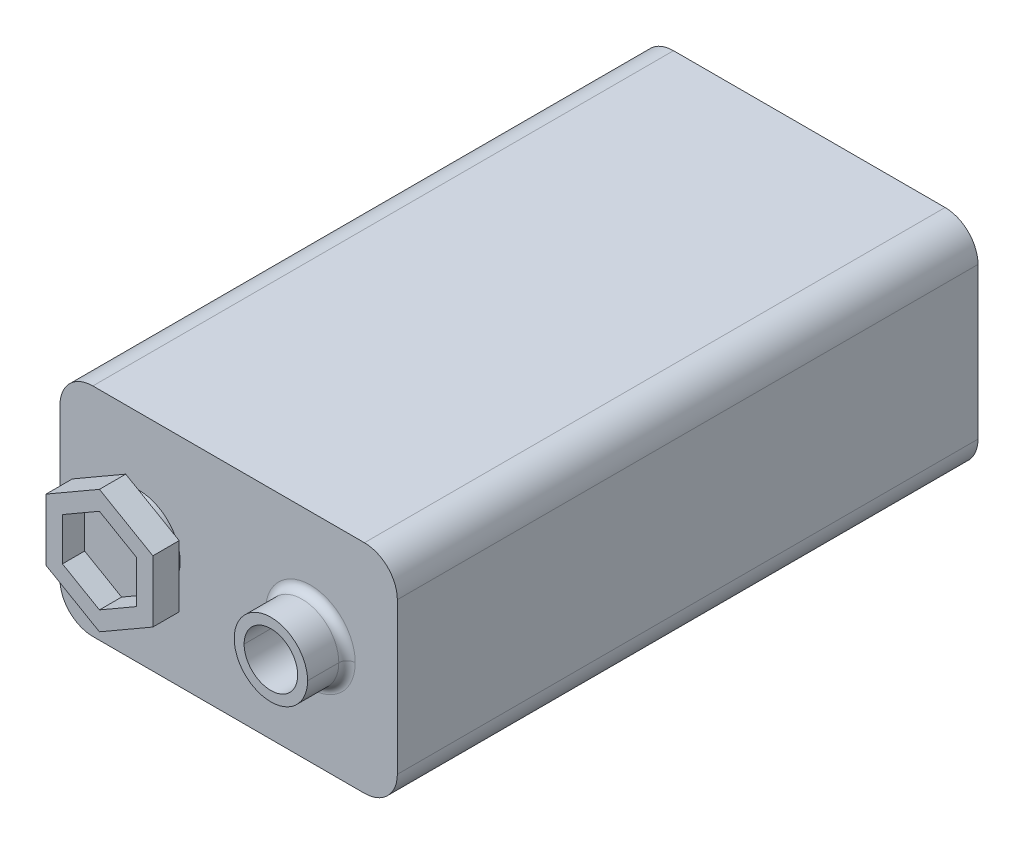
ISO-10303-21;
HEADER;
FILE_DESCRIPTION(('STEP AP214'),'2;1');
FILE_NAME('part.step','',(''),(''),'','','');
FILE_SCHEMA(('AUTOMOTIVE_DESIGN { 1 0 10303 214 1 1 1 1 }'));
ENDSEC;
DATA;
#1=APPLICATION_CONTEXT('core data for automotive mechanical design processes');
#2=APPLICATION_PROTOCOL_DEFINITION('international standard','automotive_design',2000,#1);
#3=PRODUCT_CONTEXT('',#1,'mechanical');
#4=PRODUCT('Part','Part','',(#3));
#5=PRODUCT_RELATED_PRODUCT_CATEGORY('part','',(#4));
#6=PRODUCT_DEFINITION_FORMATION('','',#4);
#7=PRODUCT_DEFINITION_CONTEXT('part definition',#1,'design');
#8=PRODUCT_DEFINITION('design','',#6,#7);
#9=PRODUCT_DEFINITION_SHAPE('','',#8);
#10=(LENGTH_UNIT() NAMED_UNIT(*) SI_UNIT(.MILLI.,.METRE.));
#11=(NAMED_UNIT(*) PLANE_ANGLE_UNIT() SI_UNIT($,.RADIAN.));
#12=(NAMED_UNIT(*) SI_UNIT($,.STERADIAN.) SOLID_ANGLE_UNIT());
#13=UNCERTAINTY_MEASURE_WITH_UNIT(LENGTH_MEASURE(1.E-05),#10,'distance_accuracy_value','');
#14=(GEOMETRIC_REPRESENTATION_CONTEXT(3) GLOBAL_UNCERTAINTY_ASSIGNED_CONTEXT((#13)) GLOBAL_UNIT_ASSIGNED_CONTEXT((#10,
#11,#12)) REPRESENTATION_CONTEXT('',''));
#15=CARTESIAN_POINT('',(0.,0.,0.));
#16=DIRECTION('',(0.,0.,1.));
#17=DIRECTION('',(1.,0.,0.));
#18=AXIS2_PLACEMENT_3D('',#15,#16,#17);
#19=CARTESIAN_POINT('',(6.3119,0.,25.654));
#20=DIRECTION('',(0.,0.,-1.));
#21=DIRECTION('',(-1.,0.,0.));
#22=AXIS2_PLACEMENT_3D('',#19,#20,#21);
#23=CYLINDRICAL_SURFACE('',#22,2.0701);
#24=DIRECTION('',(0.,0.,-1.));
#25=VECTOR('',#24,1.);
#26=CARTESIAN_POINT('',(8.382,0.,25.654));
#27=LINE('',#26,#25);
#28=CARTESIAN_POINT('',(8.382,0.,25.4762));
#29=VERTEX_POINT('',#28);
#30=CARTESIAN_POINT('',(8.382,0.,22.4282));
#31=VERTEX_POINT('',#30);
#32=EDGE_CURVE('E442',#29,#31,#27,.T.);
#33=ORIENTED_EDGE('',*,*,#32,.F.);
#34=CARTESIAN_POINT('',(6.3119,0.,25.4762));
#35=DIRECTION('',(0.,0.,1.));
#36=DIRECTION('',(1.,0.,0.));
#37=AXIS2_PLACEMENT_3D('',#34,#35,#36);
#38=CIRCLE('',#37,2.0701);
#39=CARTESIAN_POINT('',(4.2418,0.,25.4762));
#40=VERTEX_POINT('',#39);
#41=EDGE_CURVE('E381',#29,#40,#38,.T.);
#42=ORIENTED_EDGE('',*,*,#41,.T.);
#43=DIRECTION('',(0.,0.,-1.));
#44=VECTOR('',#43,1.);
#45=CARTESIAN_POINT('',(4.2418,0.,25.654));
#46=LINE('',#45,#44);
#47=CARTESIAN_POINT('',(4.2418,0.,22.4282));
#48=VERTEX_POINT('',#47);
#49=EDGE_CURVE('E458',#40,#48,#46,.T.);
#50=ORIENTED_EDGE('',*,*,#49,.T.);
#51=CARTESIAN_POINT('',(6.3119,0.,22.4282));
#52=DIRECTION('',(0.,0.,1.));
#53=DIRECTION('',(1.,0.,0.));
#54=AXIS2_PLACEMENT_3D('',#51,#52,#53);
#55=CIRCLE('',#54,2.0701);
#56=EDGE_CURVE('E11',#31,#48,#55,.T.);
#57=ORIENTED_EDGE('',*,*,#56,.F.);
#58=EDGE_LOOP('',(#33,#42,#50,#57));
#59=FACE_BOUND('',#58,.T.);
#60=ADVANCED_FACE('F16',(#59),#23,.F.);
#61=CARTESIAN_POINT('',(-13.0302,8.382,22.4282));
#62=DIRECTION('',(0.,0.,-1.));
#63=DIRECTION('',(0.,-1.,0.));
#64=AXIS2_PLACEMENT_3D('',#61,#62,#63);
#65=PLANE('',#64);
#66=CARTESIAN_POINT('',(6.3119,0.,22.4282));
#67=DIRECTION('',(0.,0.,1.));
#68=DIRECTION('',(1.,0.,0.));
#69=AXIS2_PLACEMENT_3D('',#66,#67,#68);
#70=CIRCLE('',#69,2.0701);
#71=EDGE_CURVE('E463',#48,#31,#70,.T.);
#72=ORIENTED_EDGE('',*,*,#71,.T.);
#73=ORIENTED_EDGE('',*,*,#56,.T.);
#74=EDGE_LOOP('',(#72,#73));
#75=FACE_BOUND('',#74,.T.);
#76=ADVANCED_FACE('F500',(#75),#65,.F.);
#77=CARTESIAN_POINT('',(-6.9342,3.29955678841871,42.2007207872868));
#78=DIRECTION('',(0.5,-0.866025403784439,0.));
#79=DIRECTION('',(0.,0.,-1.));
#80=AXIS2_PLACEMENT_3D('',#77,#78,#79);
#81=PLANE('',#80);
#82=DIRECTION('',(0.,0.,-1.));
#83=VECTOR('',#82,1.);
#84=CARTESIAN_POINT('',(-6.9342,3.29955678841871,42.2007207872868));
#85=LINE('',#84,#83);
#86=CARTESIAN_POINT('',(-6.9342,3.29955678841871,25.4762));
#87=VERTEX_POINT('',#86);
#88=CARTESIAN_POINT('',(-6.9342,3.29955678841871,23.7617));
#89=VERTEX_POINT('',#88);
#90=EDGE_CURVE('E341',#87,#89,#85,.T.);
#91=ORIENTED_EDGE('',*,*,#90,.F.);
#92=DIRECTION('',(-0.866025403784439,-0.5,0.));
#93=VECTOR('',#92,1.);
#94=CARTESIAN_POINT('',(-6.9342,3.29955678841871,25.4762));
#95=LINE('',#94,#93);
#96=CARTESIAN_POINT('',(-9.7917,1.64977839420935,25.4762));
#97=VERTEX_POINT('',#96);
#98=EDGE_CURVE('E378',#87,#97,#95,.T.);
#99=ORIENTED_EDGE('',*,*,#98,.T.);
#100=DIRECTION('',(0.,0.,-1.));
#101=VECTOR('',#100,1.);
#102=CARTESIAN_POINT('',(-9.7917,1.64977839420935,42.2007207872868));
#103=LINE('',#102,#101);
#104=CARTESIAN_POINT('',(-9.7917,1.64977839420935,23.7617));
#105=VERTEX_POINT('',#104);
#106=EDGE_CURVE('E27',#97,#105,#103,.T.);
#107=ORIENTED_EDGE('',*,*,#106,.T.);
#108=DIRECTION('',(-0.866025403784439,-0.5,0.));
#109=VECTOR('',#108,1.);
#110=CARTESIAN_POINT('',(-9.7917,1.64977839420935,23.7617));
#111=LINE('',#110,#109);
#112=EDGE_CURVE('E303',#89,#105,#111,.T.);
#113=ORIENTED_EDGE('',*,*,#112,.F.);
#114=EDGE_LOOP('',(#91,#99,#107,#113));
#115=FACE_BOUND('',#114,.T.);
#116=ADVANCED_FACE('F480',(#115),#81,.T.);
#117=CARTESIAN_POINT('',(-9.7917,1.64977839420935,42.2007207872868));
#118=DIRECTION('',(1.,0.,0.));
#119=DIRECTION('',(0.,1.,0.));
#120=AXIS2_PLACEMENT_3D('',#117,#118,#119);
#121=PLANE('',#120);
#122=ORIENTED_EDGE('',*,*,#106,.F.);
#123=DIRECTION('',(0.,-1.,0.));
#124=VECTOR('',#123,1.);
#125=CARTESIAN_POINT('',(-9.7917,1.64977839420935,25.4762));
#126=LINE('',#125,#124);
#127=CARTESIAN_POINT('',(-9.7917,-1.64977839420935,25.4762));
#128=VERTEX_POINT('',#127);
#129=EDGE_CURVE('E377',#97,#128,#126,.T.);
#130=ORIENTED_EDGE('',*,*,#129,.T.);
#131=DIRECTION('',(0.,0.,-1.));
#132=VECTOR('',#131,1.);
#133=CARTESIAN_POINT('',(-9.7917,-1.64977839420935,42.2007207872868));
#134=LINE('',#133,#132);
#135=CARTESIAN_POINT('',(-9.7917,-1.64977839420935,23.7617));
#136=VERTEX_POINT('',#135);
#137=EDGE_CURVE('E219',#128,#136,#134,.T.);
#138=ORIENTED_EDGE('',*,*,#137,.T.);
#139=DIRECTION('',(0.,-1.,0.));
#140=VECTOR('',#139,1.);
#141=CARTESIAN_POINT('',(-9.7917,-1.64977839420935,23.7617));
#142=LINE('',#141,#140);
#143=EDGE_CURVE('E387',#105,#136,#142,.T.);
#144=ORIENTED_EDGE('',*,*,#143,.F.);
#145=EDGE_LOOP('',(#122,#130,#138,#144));
#146=FACE_BOUND('',#145,.T.);
#147=ADVANCED_FACE('F488',(#146),#121,.T.);
#148=CARTESIAN_POINT('',(-9.7917,-1.64977839420935,42.2007207872868));
#149=DIRECTION('',(0.5,0.866025403784439,0.));
#150=DIRECTION('',(0.,0.,-1.));
#151=AXIS2_PLACEMENT_3D('',#148,#149,#150);
#152=PLANE('',#151);
#153=ORIENTED_EDGE('',*,*,#137,.F.);
#154=DIRECTION('',(0.866025403784439,-0.5,0.));
#155=VECTOR('',#154,1.);
#156=CARTESIAN_POINT('',(-9.7917,-1.64977839420935,25.4762));
#157=LINE('',#156,#155);
#158=CARTESIAN_POINT('',(-6.9342,-3.29955678841871,25.4762));
#159=VERTEX_POINT('',#158);
#160=EDGE_CURVE('E379',#128,#159,#157,.T.);
#161=ORIENTED_EDGE('',*,*,#160,.T.);
#162=DIRECTION('',(0.,0.,-1.));
#163=VECTOR('',#162,1.);
#164=CARTESIAN_POINT('',(-6.9342,-3.29955678841871,42.2007207872868));
#165=LINE('',#164,#163);
#166=CARTESIAN_POINT('',(-6.9342,-3.29955678841871,23.7617));
#167=VERTEX_POINT('',#166);
#168=EDGE_CURVE('E310',#159,#167,#165,.T.);
#169=ORIENTED_EDGE('',*,*,#168,.T.);
#170=DIRECTION('',(0.866025403784439,-0.5,0.));
#171=VECTOR('',#170,1.);
#172=CARTESIAN_POINT('',(-6.9342,-3.29955678841871,23.7617));
#173=LINE('',#172,#171);
#174=EDGE_CURVE('E332',#136,#167,#173,.T.);
#175=ORIENTED_EDGE('',*,*,#174,.F.);
#176=EDGE_LOOP('',(#153,#161,#169,#175));
#177=FACE_BOUND('',#176,.T.);
#178=ADVANCED_FACE('F490',(#177),#152,.T.);
#179=CARTESIAN_POINT('',(-6.9342,-3.29955678841871,42.2007207872868));
#180=DIRECTION('',(-0.5,0.866025403784439,0.));
#181=DIRECTION('',(0.,0.,1.));
#182=AXIS2_PLACEMENT_3D('',#179,#180,#181);
#183=PLANE('',#182);
#184=ORIENTED_EDGE('',*,*,#168,.F.);
#185=DIRECTION('',(0.866025403784439,0.5,0.));
#186=VECTOR('',#185,1.);
#187=CARTESIAN_POINT('',(-6.9342,-3.29955678841871,25.4762));
#188=LINE('',#187,#186);
#189=CARTESIAN_POINT('',(-4.0767,-1.64977839420935,25.4762));
#190=VERTEX_POINT('',#189);
#191=EDGE_CURVE('E427',#159,#190,#188,.T.);
#192=ORIENTED_EDGE('',*,*,#191,.T.);
#193=DIRECTION('',(0.,0.,-1.));
#194=VECTOR('',#193,1.);
#195=CARTESIAN_POINT('',(-4.0767,-1.64977839420935,42.2007207872868));
#196=LINE('',#195,#194);
#197=CARTESIAN_POINT('',(-4.0767,-1.64977839420935,23.7617));
#198=VERTEX_POINT('',#197);
#199=EDGE_CURVE('E313',#190,#198,#196,.T.);
#200=ORIENTED_EDGE('',*,*,#199,.T.);
#201=DIRECTION('',(0.866025403784439,0.5,0.));
#202=VECTOR('',#201,1.);
#203=CARTESIAN_POINT('',(-4.0767,-1.64977839420935,23.7617));
#204=LINE('',#203,#202);
#205=EDGE_CURVE('E329',#167,#198,#204,.T.);
#206=ORIENTED_EDGE('',*,*,#205,.F.);
#207=EDGE_LOOP('',(#184,#192,#200,#206));
#208=FACE_BOUND('',#207,.T.);
#209=ADVANCED_FACE('F497',(#208),#183,.T.);
#210=CARTESIAN_POINT('',(-4.0767,-1.64977839420935,42.2007207872868));
#211=DIRECTION('',(-1.,0.,0.));
#212=DIRECTION('',(0.,0.,1.));
#213=AXIS2_PLACEMENT_3D('',#210,#211,#212);
#214=PLANE('',#213);
#215=ORIENTED_EDGE('',*,*,#199,.F.);
#216=DIRECTION('',(0.,1.,0.));
#217=VECTOR('',#216,1.);
#218=CARTESIAN_POINT('',(-4.0767,-1.64977839420935,25.4762));
#219=LINE('',#218,#217);
#220=CARTESIAN_POINT('',(-4.0767,1.64977839420935,25.4762));
#221=VERTEX_POINT('',#220);
#222=EDGE_CURVE('E605',#190,#221,#219,.T.);
#223=ORIENTED_EDGE('',*,*,#222,.T.);
#224=DIRECTION('',(0.,0.,-1.));
#225=VECTOR('',#224,1.);
#226=CARTESIAN_POINT('',(-4.0767,1.64977839420935,42.2007207872868));
#227=LINE('',#226,#225);
#228=CARTESIAN_POINT('',(-4.0767,1.64977839420935,23.7617));
#229=VERTEX_POINT('',#228);
#230=EDGE_CURVE('E298',#221,#229,#227,.T.);
#231=ORIENTED_EDGE('',*,*,#230,.T.);
#232=DIRECTION('',(0.,1.,0.));
#233=VECTOR('',#232,1.);
#234=CARTESIAN_POINT('',(-4.0767,1.64977839420935,23.7617));
#235=LINE('',#234,#233);
#236=EDGE_CURVE('E20',#198,#229,#235,.T.);
#237=ORIENTED_EDGE('',*,*,#236,.F.);
#238=EDGE_LOOP('',(#215,#223,#231,#237));
#239=FACE_BOUND('',#238,.T.);
#240=ADVANCED_FACE('F514',(#239),#214,.T.);
#241=CARTESIAN_POINT('',(-4.0767,1.64977839420935,42.2007207872868));
#242=DIRECTION('',(-0.5,-0.866025403784439,0.));
#243=DIRECTION('',(-0.866025403784439,0.5,0.));
#244=AXIS2_PLACEMENT_3D('',#241,#242,#243);
#245=PLANE('',#244);
#246=ORIENTED_EDGE('',*,*,#230,.F.);
#247=DIRECTION('',(-0.866025403784439,0.5,0.));
#248=VECTOR('',#247,1.);
#249=CARTESIAN_POINT('',(-4.0767,1.64977839420935,25.4762));
#250=LINE('',#249,#248);
#251=EDGE_CURVE('E602',#221,#87,#250,.T.);
#252=ORIENTED_EDGE('',*,*,#251,.T.);
#253=ORIENTED_EDGE('',*,*,#90,.T.);
#254=DIRECTION('',(-0.866025403784439,0.5,0.));
#255=VECTOR('',#254,1.);
#256=CARTESIAN_POINT('',(-6.9342,3.29955678841871,23.7617));
#257=LINE('',#256,#255);
#258=EDGE_CURVE('E300',#229,#89,#257,.T.);
#259=ORIENTED_EDGE('',*,*,#258,.F.);
#260=EDGE_LOOP('',(#246,#252,#253,#259));
#261=FACE_BOUND('',#260,.T.);
#262=ADVANCED_FACE('F18',(#261),#245,.T.);
#263=CARTESIAN_POINT('',(0.,0.,23.7617));
#264=DIRECTION('',(0.,0.,-1.));
#265=DIRECTION('',(0.,-1.,0.));
#266=AXIS2_PLACEMENT_3D('',#263,#264,#265);
#267=PLANE('',#266);
#268=ORIENTED_EDGE('',*,*,#174,.T.);
#269=ORIENTED_EDGE('',*,*,#205,.T.);
#270=ORIENTED_EDGE('',*,*,#236,.T.);
#271=ORIENTED_EDGE('',*,*,#258,.T.);
#272=ORIENTED_EDGE('',*,*,#112,.T.);
#273=ORIENTED_EDGE('',*,*,#143,.T.);
#274=EDGE_LOOP('',(#268,#269,#270,#271,#272,#273));
#275=FACE_BOUND('',#274,.T.);
#276=ADVANCED_FACE('F1143',(#275),#267,.F.);
#277=CARTESIAN_POINT('',(-13.0302,8.382,25.4762));
#278=DIRECTION('',(0.,0.,1.));
#279=DIRECTION('',(1.,0.,0.));
#280=AXIS2_PLACEMENT_3D('',#277,#278,#279);
#281=PLANE('',#280);
#282=CARTESIAN_POINT('',(6.3119,0.,25.4762));
#283=DIRECTION('',(0.,0.,1.));
#284=DIRECTION('',(1.,0.,0.));
#285=AXIS2_PLACEMENT_3D('',#282,#283,#284);
#286=CIRCLE('',#285,2.0701);
#287=EDGE_CURVE('E438',#40,#29,#286,.T.);
#288=ORIENTED_EDGE('',*,*,#287,.F.);
#289=ORIENTED_EDGE('',*,*,#41,.F.);
#290=EDGE_LOOP('',(#288,#289));
#291=FACE_BOUND('',#290,.T.);
#292=CARTESIAN_POINT('',(6.3119,0.,25.4762));
#293=DIRECTION('',(0.,0.,1.));
#294=DIRECTION('',(1.,0.,0.));
#295=AXIS2_PLACEMENT_3D('',#292,#293,#294);
#296=CIRCLE('',#295,2.8321);
#297=CARTESIAN_POINT('',(3.4798,0.,25.4762));
#298=VERTEX_POINT('',#297);
#299=CARTESIAN_POINT('',(9.144,0.,25.4762));
#300=VERTEX_POINT('',#299);
#301=EDGE_CURVE('E348',#298,#300,#296,.T.);
#302=ORIENTED_EDGE('',*,*,#301,.T.);
#303=CARTESIAN_POINT('',(6.3119,0.,25.4762));
#304=DIRECTION('',(0.,0.,1.));
#305=DIRECTION('',(1.,0.,0.));
#306=AXIS2_PLACEMENT_3D('',#303,#304,#305);
#307=CIRCLE('',#306,2.8321);
#308=EDGE_CURVE('E372',#300,#298,#307,.T.);
#309=ORIENTED_EDGE('',*,*,#308,.T.);
#310=EDGE_LOOP('',(#302,#309));
#311=FACE_BOUND('',#310,.T.);
#312=ADVANCED_FACE('F672',(#291,#311),#281,.T.);
#313=CARTESIAN_POINT('',(-13.0302,8.382,25.4762));
#314=DIRECTION('',(0.,0.,1.));
#315=DIRECTION('',(1.,0.,0.));
#316=AXIS2_PLACEMENT_3D('',#313,#314,#315);
#317=PLANE('',#316);
#318=ORIENTED_EDGE('',*,*,#251,.F.);
#319=ORIENTED_EDGE('',*,*,#222,.F.);
#320=ORIENTED_EDGE('',*,*,#191,.F.);
#321=ORIENTED_EDGE('',*,*,#160,.F.);
#322=ORIENTED_EDGE('',*,*,#129,.F.);
#323=ORIENTED_EDGE('',*,*,#98,.F.);
#324=EDGE_LOOP('',(#318,#319,#320,#321,#322,#323));
#325=FACE_BOUND('',#324,.T.);
#326=DIRECTION('',(0.,1.,0.));
#327=VECTOR('',#326,1.);
#328=CARTESIAN_POINT('',(-2.8067,-2.38301323608018,25.4762));
#329=LINE('',#328,#327);
#330=CARTESIAN_POINT('',(-2.8067,-2.38301323608018,25.4762));
#331=VERTEX_POINT('',#330);
#332=CARTESIAN_POINT('',(-2.8067,2.38301323608018,25.4762));
#333=VERTEX_POINT('',#332);
#334=EDGE_CURVE('E359',#331,#333,#329,.T.);
#335=ORIENTED_EDGE('',*,*,#334,.T.);
#336=DIRECTION('',(-0.866025403784439,0.5,0.));
#337=VECTOR('',#336,1.);
#338=CARTESIAN_POINT('',(-2.8067,2.38301323608018,25.4762));
#339=LINE('',#338,#337);
#340=CARTESIAN_POINT('',(-6.9342,4.76602647216036,25.4762));
#341=VERTEX_POINT('',#340);
#342=EDGE_CURVE('E324',#333,#341,#339,.T.);
#343=ORIENTED_EDGE('',*,*,#342,.T.);
#344=DIRECTION('',(-0.866025403784439,-0.5,0.));
#345=VECTOR('',#344,1.);
#346=CARTESIAN_POINT('',(-6.9342,4.76602647216036,25.4762));
#347=LINE('',#346,#345);
#348=CARTESIAN_POINT('',(-11.0617,2.38301323608018,25.4762));
#349=VERTEX_POINT('',#348);
#350=EDGE_CURVE('E429',#341,#349,#347,.T.);
#351=ORIENTED_EDGE('',*,*,#350,.T.);
#352=DIRECTION('',(0.,-1.,0.));
#353=VECTOR('',#352,1.);
#354=CARTESIAN_POINT('',(-11.0617,2.38301323608018,25.4762));
#355=LINE('',#354,#353);
#356=CARTESIAN_POINT('',(-11.0617,-2.38301323608018,25.4762));
#357=VERTEX_POINT('',#356);
#358=EDGE_CURVE('E399',#349,#357,#355,.T.);
#359=ORIENTED_EDGE('',*,*,#358,.T.);
#360=DIRECTION('',(0.866025403784439,-0.5,0.));
#361=VECTOR('',#360,1.);
#362=CARTESIAN_POINT('',(-11.0617,-2.38301323608018,25.4762));
#363=LINE('',#362,#361);
#364=CARTESIAN_POINT('',(-6.9342,-4.76602647216036,25.4762));
#365=VERTEX_POINT('',#364);
#366=EDGE_CURVE('E539',#357,#365,#363,.T.);
#367=ORIENTED_EDGE('',*,*,#366,.T.);
#368=DIRECTION('',(0.866025403784439,0.5,0.));
#369=VECTOR('',#368,1.);
#370=CARTESIAN_POINT('',(-6.9342,-4.76602647216036,25.4762));
#371=LINE('',#370,#369);
#372=EDGE_CURVE('E409',#365,#331,#371,.T.);
#373=ORIENTED_EDGE('',*,*,#372,.T.);
#374=EDGE_LOOP('',(#335,#343,#351,#359,#367,#373));
#375=FACE_BOUND('',#374,.T.);
#376=ADVANCED_FACE('F485',(#325,#375),#317,.T.);
#377=CARTESIAN_POINT('',(-6.9342,0.,22.8092));
#378=DIRECTION('',(0.,0.,1.));
#379=DIRECTION('',(1.,0.,0.));
#380=AXIS2_PLACEMENT_3D('',#377,#378,#379);
#381=TOROIDAL_SURFACE('',#380,3.8227,0.635);
#382=CARTESIAN_POINT('',(-10.7569,0.,22.8092));
#383=DIRECTION('',(0.,1.,0.));
#384=DIRECTION('',(-1.,0.,0.));
#385=AXIS2_PLACEMENT_3D('',#382,#383,#384);
#386=CIRCLE('',#385,0.635);
#387=CARTESIAN_POINT('',(-10.7569,0.,23.4442));
#388=VERTEX_POINT('',#387);
#389=CARTESIAN_POINT('',(-10.1219,0.,22.8092));
#390=VERTEX_POINT('',#389);
#391=EDGE_CURVE('E464',#388,#390,#386,.T.);
#392=ORIENTED_EDGE('',*,*,#391,.F.);
#393=CARTESIAN_POINT('',(-6.9342,0.,23.4442));
#394=DIRECTION('',(0.,0.,1.));
#395=DIRECTION('',(1.,0.,0.));
#396=AXIS2_PLACEMENT_3D('',#393,#394,#395);
#397=CIRCLE('',#396,3.8227);
#398=CARTESIAN_POINT('',(-3.1115,0.,23.4442));
#399=VERTEX_POINT('',#398);
#400=EDGE_CURVE('E337',#399,#388,#397,.T.);
#401=ORIENTED_EDGE('',*,*,#400,.F.);
#402=CARTESIAN_POINT('',(-3.1115,0.,22.8092));
#403=DIRECTION('',(0.,-1.,0.));
#404=DIRECTION('',(0.,0.,-1.));
#405=AXIS2_PLACEMENT_3D('',#402,#403,#404);
#406=CIRCLE('',#405,0.635);
#407=CARTESIAN_POINT('',(-3.7465,0.,22.8092));
#408=VERTEX_POINT('',#407);
#409=EDGE_CURVE('E417',#399,#408,#406,.T.);
#410=ORIENTED_EDGE('',*,*,#409,.T.);
#411=CARTESIAN_POINT('',(-6.9342,0.,22.8092));
#412=DIRECTION('',(0.,0.,-1.));
#413=DIRECTION('',(1.,0.,0.));
#414=AXIS2_PLACEMENT_3D('',#411,#412,#413);
#415=CIRCLE('',#414,3.1877);
#416=EDGE_CURVE('E620',#390,#408,#415,.T.);
#417=ORIENTED_EDGE('',*,*,#416,.F.);
#418=EDGE_LOOP('',(#392,#401,#410,#417));
#419=FACE_BOUND('',#418,.T.);
#420=ADVANCED_FACE('F1197',(#419),#381,.F.);
#421=CARTESIAN_POINT('',(6.3119,0.,23.0632));
#422=DIRECTION('',(0.,0.,-1.));
#423=DIRECTION('',(-1.,0.,0.));
#424=AXIS2_PLACEMENT_3D('',#421,#422,#423);
#425=TOROIDAL_SURFACE('',#424,3.4671,0.635);
#426=CARTESIAN_POINT('',(9.779,0.,23.0632));
#427=DIRECTION('',(0.,1.,0.));
#428=DIRECTION('',(-1.,0.,0.));
#429=AXIS2_PLACEMENT_3D('',#426,#427,#428);
#430=CIRCLE('',#429,0.635);
#431=CARTESIAN_POINT('',(9.779,0.,22.4282));
#432=VERTEX_POINT('',#431);
#433=CARTESIAN_POINT('',(9.144,0.,23.0632));
#434=VERTEX_POINT('',#433);
#435=EDGE_CURVE('E468',#432,#434,#430,.T.);
#436=ORIENTED_EDGE('',*,*,#435,.F.);
#437=CARTESIAN_POINT('',(6.3119,0.,22.4282));
#438=DIRECTION('',(0.,0.,-1.));
#439=DIRECTION('',(-1.,0.,0.));
#440=AXIS2_PLACEMENT_3D('',#437,#438,#439);
#441=CIRCLE('',#440,3.4671);
#442=CARTESIAN_POINT('',(2.8448,0.,22.4282));
#443=VERTEX_POINT('',#442);
#444=EDGE_CURVE('E474',#443,#432,#441,.T.);
#445=ORIENTED_EDGE('',*,*,#444,.F.);
#446=CARTESIAN_POINT('',(2.8448,0.,23.0632));
#447=DIRECTION('',(0.,-1.,0.));
#448=DIRECTION('',(0.,0.,-1.));
#449=AXIS2_PLACEMENT_3D('',#446,#447,#448);
#450=CIRCLE('',#449,0.635);
#451=CARTESIAN_POINT('',(3.4798,0.,23.0632));
#452=VERTEX_POINT('',#451);
#453=EDGE_CURVE('E624',#443,#452,#450,.T.);
#454=ORIENTED_EDGE('',*,*,#453,.T.);
#455=CARTESIAN_POINT('',(6.3119,0.,23.0632));
#456=DIRECTION('',(0.,0.,1.));
#457=DIRECTION('',(-1.,0.,0.));
#458=AXIS2_PLACEMENT_3D('',#455,#456,#457);
#459=CIRCLE('',#458,2.8321);
#460=EDGE_CURVE('E349',#434,#452,#459,.T.);
#461=ORIENTED_EDGE('',*,*,#460,.F.);
#462=EDGE_LOOP('',(#436,#445,#454,#461));
#463=FACE_BOUND('',#462,.T.);
#464=ADVANCED_FACE('F663',(#463),#425,.F.);
#465=CARTESIAN_POINT('',(-10.4902,5.842,0.));
#466=DIRECTION('',(0.,0.,1.));
#467=DIRECTION('',(1.,0.,0.));
#468=AXIS2_PLACEMENT_3D('',#465,#466,#467);
#469=CYLINDRICAL_SURFACE('',#468,2.54);
#470=CARTESIAN_POINT('',(-10.4902,5.842,-22.4282));
#471=DIRECTION('',(0.,0.,-1.));
#472=DIRECTION('',(1.,0.,0.));
#473=AXIS2_PLACEMENT_3D('',#470,#471,#472);
#474=CIRCLE('',#473,2.54);
#475=CARTESIAN_POINT('',(-13.0302,5.842,-22.4282));
#476=VERTEX_POINT('',#475);
#477=CARTESIAN_POINT('',(-10.4902,8.382,-22.4282));
#478=VERTEX_POINT('',#477);
#479=EDGE_CURVE('E452',#476,#478,#474,.T.);
#480=ORIENTED_EDGE('',*,*,#479,.F.);
#481=DIRECTION('',(0.,0.,-1.));
#482=VECTOR('',#481,1.);
#483=CARTESIAN_POINT('',(-13.0302,5.842,22.4282));
#484=LINE('',#483,#482);
#485=CARTESIAN_POINT('',(-13.0302,5.842,22.4282));
#486=VERTEX_POINT('',#485);
#487=EDGE_CURVE('E287',#486,#476,#484,.T.);
#488=ORIENTED_EDGE('',*,*,#487,.F.);
#489=CARTESIAN_POINT('',(-10.4902,5.842,22.4282));
#490=DIRECTION('',(0.,0.,1.));
#491=DIRECTION('',(-1.,0.,0.));
#492=AXIS2_PLACEMENT_3D('',#489,#490,#491);
#493=CIRCLE('',#492,2.54);
#494=CARTESIAN_POINT('',(-10.4902,8.382,22.4282));
#495=VERTEX_POINT('',#494);
#496=EDGE_CURVE('E280',#495,#486,#493,.T.);
#497=ORIENTED_EDGE('',*,*,#496,.F.);
#498=DIRECTION('',(0.,0.,1.));
#499=VECTOR('',#498,1.);
#500=CARTESIAN_POINT('',(-10.4902,8.382,0.));
#501=LINE('',#500,#499);
#502=EDGE_CURVE('E270',#478,#495,#501,.T.);
#503=ORIENTED_EDGE('',*,*,#502,.F.);
#504=EDGE_LOOP('',(#480,#488,#497,#503));
#505=FACE_BOUND('',#504,.T.);
#506=ADVANCED_FACE('F525',(#505),#469,.T.);
#507=CARTESIAN_POINT('',(-10.4902,-5.842,22.4282));
#508=DIRECTION('',(0.,0.,-1.));
#509=DIRECTION('',(-1.,0.,0.));
#510=AXIS2_PLACEMENT_3D('',#507,#508,#509);
#511=CYLINDRICAL_SURFACE('',#510,2.54);
#512=CARTESIAN_POINT('',(-10.4902,-5.842,-22.4282));
#513=DIRECTION('',(0.,0.,-1.));
#514=DIRECTION('',(1.,0.,0.));
#515=AXIS2_PLACEMENT_3D('',#512,#513,#514);
#516=CIRCLE('',#515,2.54);
#517=CARTESIAN_POINT('',(-10.4902,-8.382,-22.4282));
#518=VERTEX_POINT('',#517);
#519=CARTESIAN_POINT('',(-13.0302,-5.842,-22.4282));
#520=VERTEX_POINT('',#519);
#521=EDGE_CURVE('E415',#518,#520,#516,.T.);
#522=ORIENTED_EDGE('',*,*,#521,.F.);
#523=DIRECTION('',(0.,0.,-1.));
#524=VECTOR('',#523,1.);
#525=CARTESIAN_POINT('',(-10.4902,-8.382,-22.4282));
#526=LINE('',#525,#524);
#527=CARTESIAN_POINT('',(-10.4902,-8.382,22.4282));
#528=VERTEX_POINT('',#527);
#529=EDGE_CURVE('E334',#528,#518,#526,.T.);
#530=ORIENTED_EDGE('',*,*,#529,.F.);
#531=CARTESIAN_POINT('',(-10.4902,-5.842,22.4282));
#532=DIRECTION('',(0.,0.,1.));
#533=DIRECTION('',(-1.,0.,0.));
#534=AXIS2_PLACEMENT_3D('',#531,#532,#533);
#535=CIRCLE('',#534,2.54);
#536=CARTESIAN_POINT('',(-13.0302,-5.842,22.4282));
#537=VERTEX_POINT('',#536);
#538=EDGE_CURVE('E395',#537,#528,#535,.T.);
#539=ORIENTED_EDGE('',*,*,#538,.F.);
#540=DIRECTION('',(0.,0.,1.));
#541=VECTOR('',#540,1.);
#542=CARTESIAN_POINT('',(-13.0302,-5.842,22.4282));
#543=LINE('',#542,#541);
#544=EDGE_CURVE('E448',#520,#537,#543,.T.);
#545=ORIENTED_EDGE('',*,*,#544,.F.);
#546=EDGE_LOOP('',(#522,#530,#539,#545));
#547=FACE_BOUND('',#546,.T.);
#548=ADVANCED_FACE('F522',(#547),#511,.T.);
#549=CARTESIAN_POINT('',(10.4902,-5.842,22.4282));
#550=DIRECTION('',(0.,0.,1.));
#551=DIRECTION('',(1.,0.,0.));
#552=AXIS2_PLACEMENT_3D('',#549,#550,#551);
#553=CYLINDRICAL_SURFACE('',#552,2.54);
#554=CARTESIAN_POINT('',(10.4902,-5.842,22.4282));
#555=DIRECTION('',(0.,0.,1.));
#556=DIRECTION('',(-1.,0.,0.));
#557=AXIS2_PLACEMENT_3D('',#554,#555,#556);
#558=CIRCLE('',#557,2.54);
#559=CARTESIAN_POINT('',(10.4902,-8.382,22.4282));
#560=VERTEX_POINT('',#559);
#561=CARTESIAN_POINT('',(13.0302,-5.842,22.4282));
#562=VERTEX_POINT('',#561);
#563=EDGE_CURVE('E394',#560,#562,#558,.T.);
#564=ORIENTED_EDGE('',*,*,#563,.F.);
#565=DIRECTION('',(0.,0.,1.));
#566=VECTOR('',#565,1.);
#567=CARTESIAN_POINT('',(10.4902,-8.382,22.4282));
#568=LINE('',#567,#566);
#569=CARTESIAN_POINT('',(10.4902,-8.382,-22.4282));
#570=VERTEX_POINT('',#569);
#571=EDGE_CURVE('E338',#570,#560,#568,.T.);
#572=ORIENTED_EDGE('',*,*,#571,.F.);
#573=CARTESIAN_POINT('',(10.4902,-5.842,-22.4282));
#574=DIRECTION('',(0.,0.,-1.));
#575=DIRECTION('',(1.,0.,0.));
#576=AXIS2_PLACEMENT_3D('',#573,#574,#575);
#577=CIRCLE('',#576,2.54);
#578=CARTESIAN_POINT('',(13.0302,-5.842,-22.4282));
#579=VERTEX_POINT('',#578);
#580=EDGE_CURVE('E416',#579,#570,#577,.T.);
#581=ORIENTED_EDGE('',*,*,#580,.F.);
#582=DIRECTION('',(0.,0.,-1.));
#583=VECTOR('',#582,1.);
#584=CARTESIAN_POINT('',(13.0302,-5.842,-22.4282));
#585=LINE('',#584,#583);
#586=EDGE_CURVE('E314',#562,#579,#585,.T.);
#587=ORIENTED_EDGE('',*,*,#586,.F.);
#588=EDGE_LOOP('',(#564,#572,#581,#587));
#589=FACE_BOUND('',#588,.T.);
#590=ADVANCED_FACE('F524',(#589),#553,.T.);
#591=CARTESIAN_POINT('',(10.4902,5.842,0.));
#592=DIRECTION('',(0.,0.,-1.));
#593=DIRECTION('',(-1.,0.,0.));
#594=AXIS2_PLACEMENT_3D('',#591,#592,#593);
#595=CYLINDRICAL_SURFACE('',#594,2.54);
#596=CARTESIAN_POINT('',(10.4902,5.842,22.4282));
#597=DIRECTION('',(0.,0.,1.));
#598=DIRECTION('',(-1.,0.,0.));
#599=AXIS2_PLACEMENT_3D('',#596,#597,#598);
#600=CIRCLE('',#599,2.54);
#601=CARTESIAN_POINT('',(13.0302,5.842,22.4282));
#602=VERTEX_POINT('',#601);
#603=CARTESIAN_POINT('',(10.4902,8.382,22.4282));
#604=VERTEX_POINT('',#603);
#605=EDGE_CURVE('E263',#602,#604,#600,.T.);
#606=ORIENTED_EDGE('',*,*,#605,.F.);
#607=DIRECTION('',(0.,0.,1.));
#608=VECTOR('',#607,1.);
#609=CARTESIAN_POINT('',(13.0302,5.842,22.4282));
#610=LINE('',#609,#608);
#611=CARTESIAN_POINT('',(13.0302,5.842,-22.4282));
#612=VERTEX_POINT('',#611);
#613=EDGE_CURVE('E323',#612,#602,#610,.T.);
#614=ORIENTED_EDGE('',*,*,#613,.F.);
#615=CARTESIAN_POINT('',(10.4902,5.842,-22.4282));
#616=DIRECTION('',(0.,0.,-1.));
#617=DIRECTION('',(1.,0.,0.));
#618=AXIS2_PLACEMENT_3D('',#615,#616,#617);
#619=CIRCLE('',#618,2.54);
#620=CARTESIAN_POINT('',(10.4902,8.382,-22.4282));
#621=VERTEX_POINT('',#620);
#622=EDGE_CURVE('E265',#621,#612,#619,.T.);
#623=ORIENTED_EDGE('',*,*,#622,.F.);
#624=DIRECTION('',(0.,0.,-1.));
#625=VECTOR('',#624,1.);
#626=CARTESIAN_POINT('',(10.4902,8.382,0.));
#627=LINE('',#626,#625);
#628=EDGE_CURVE('E258',#604,#621,#627,.T.);
#629=ORIENTED_EDGE('',*,*,#628,.F.);
#630=EDGE_LOOP('',(#606,#614,#623,#629));
#631=FACE_BOUND('',#630,.T.);
#632=ADVANCED_FACE('F260',(#631),#595,.T.);
#633=CARTESIAN_POINT('',(0.,0.,23.4442));
#634=DIRECTION('',(0.,0.,1.));
#635=DIRECTION('',(1.,0.,0.));
#636=AXIS2_PLACEMENT_3D('',#633,#634,#635);
#637=PLANE('',#636);
#638=ORIENTED_EDGE('',*,*,#400,.T.);
#639=CARTESIAN_POINT('',(-6.9342,0.,23.4442));
#640=DIRECTION('',(0.,0.,1.));
#641=DIRECTION('',(1.,0.,0.));
#642=AXIS2_PLACEMENT_3D('',#639,#640,#641);
#643=CIRCLE('',#642,3.8227);
#644=EDGE_CURVE('E462',#388,#399,#643,.T.);
#645=ORIENTED_EDGE('',*,*,#644,.T.);
#646=EDGE_LOOP('',(#638,#645));
#647=FACE_BOUND('',#646,.T.);
#648=DIRECTION('',(0.,1.,0.));
#649=VECTOR('',#648,1.);
#650=CARTESIAN_POINT('',(-2.8067,-2.38301323608018,23.4442));
#651=LINE('',#650,#649);
#652=CARTESIAN_POINT('',(-2.8067,-2.38301323608018,23.4442));
#653=VERTEX_POINT('',#652);
#654=CARTESIAN_POINT('',(-2.8067,2.38301323608018,23.4442));
#655=VERTEX_POINT('',#654);
#656=EDGE_CURVE('E304',#653,#655,#651,.T.);
#657=ORIENTED_EDGE('',*,*,#656,.F.);
#658=DIRECTION('',(0.866025403784439,0.5,0.));
#659=VECTOR('',#658,1.);
#660=CARTESIAN_POINT('',(-6.9342,-4.76602647216036,23.4442));
#661=LINE('',#660,#659);
#662=CARTESIAN_POINT('',(-6.9342,-4.76602647216036,23.4442));
#663=VERTEX_POINT('',#662);
#664=EDGE_CURVE('E345',#663,#653,#661,.T.);
#665=ORIENTED_EDGE('',*,*,#664,.F.);
#666=DIRECTION('',(0.866025403784439,-0.5,0.));
#667=VECTOR('',#666,1.);
#668=CARTESIAN_POINT('',(-11.0617,-2.38301323608018,23.4442));
#669=LINE('',#668,#667);
#670=CARTESIAN_POINT('',(-11.0617,-2.38301323608018,23.4442));
#671=VERTEX_POINT('',#670);
#672=EDGE_CURVE('E410',#671,#663,#669,.T.);
#673=ORIENTED_EDGE('',*,*,#672,.F.);
#674=DIRECTION('',(0.,-1.,0.));
#675=VECTOR('',#674,1.);
#676=CARTESIAN_POINT('',(-11.0617,2.38301323608018,23.4442));
#677=LINE('',#676,#675);
#678=CARTESIAN_POINT('',(-11.0617,2.38301323608018,23.4442));
#679=VERTEX_POINT('',#678);
#680=EDGE_CURVE('E403',#679,#671,#677,.T.);
#681=ORIENTED_EDGE('',*,*,#680,.F.);
#682=DIRECTION('',(-0.866025403784439,-0.5,0.));
#683=VECTOR('',#682,1.);
#684=CARTESIAN_POINT('',(-6.9342,4.76602647216036,23.4442));
#685=LINE('',#684,#683);
#686=CARTESIAN_POINT('',(-6.9342,4.76602647216036,23.4442));
#687=VERTEX_POINT('',#686);
#688=EDGE_CURVE('E433',#687,#679,#685,.T.);
#689=ORIENTED_EDGE('',*,*,#688,.F.);
#690=DIRECTION('',(-0.866025403784439,0.5,0.));
#691=VECTOR('',#690,1.);
#692=CARTESIAN_POINT('',(-2.8067,2.38301323608018,23.4442));
#693=LINE('',#692,#691);
#694=EDGE_CURVE('E328',#655,#687,#693,.T.);
#695=ORIENTED_EDGE('',*,*,#694,.F.);
#696=EDGE_LOOP('',(#657,#665,#673,#681,#689,#695));
#697=FACE_BOUND('',#696,.T.);
#698=ADVANCED_FACE('F917',(#647,#697),#637,.F.);
#699=CARTESIAN_POINT('',(-6.9342,0.,23.4442));
#700=DIRECTION('',(0.,0.,-1.));
#701=DIRECTION('',(-1.,0.,0.));
#702=AXIS2_PLACEMENT_3D('',#699,#700,#701);
#703=CYLINDRICAL_SURFACE('',#702,3.1877);
#704=DIRECTION('',(0.,0.,-1.));
#705=VECTOR('',#704,1.);
#706=CARTESIAN_POINT('',(-3.7465,0.,23.4442));
#707=LINE('',#706,#705);
#708=CARTESIAN_POINT('',(-3.7465,0.,22.4282));
#709=VERTEX_POINT('',#708);
#710=EDGE_CURVE('E616',#408,#709,#707,.T.);
#711=ORIENTED_EDGE('',*,*,#710,.F.);
#712=CARTESIAN_POINT('',(-6.9342,0.,22.8092));
#713=DIRECTION('',(0.,0.,-1.));
#714=DIRECTION('',(1.,0.,0.));
#715=AXIS2_PLACEMENT_3D('',#712,#713,#714);
#716=CIRCLE('',#715,3.1877);
#717=EDGE_CURVE('E422',#408,#390,#716,.T.);
#718=ORIENTED_EDGE('',*,*,#717,.T.);
#719=DIRECTION('',(0.,0.,-1.));
#720=VECTOR('',#719,1.);
#721=CARTESIAN_POINT('',(-10.1219,0.,23.4442));
#722=LINE('',#721,#720);
#723=CARTESIAN_POINT('',(-10.1219,0.,22.4282));
#724=VERTEX_POINT('',#723);
#725=EDGE_CURVE('E569',#390,#724,#722,.T.);
#726=ORIENTED_EDGE('',*,*,#725,.T.);
#727=CARTESIAN_POINT('',(-6.9342,0.,22.4282));
#728=DIRECTION('',(0.,0.,1.));
#729=DIRECTION('',(-1.,0.,0.));
#730=AXIS2_PLACEMENT_3D('',#727,#728,#729);
#731=CIRCLE('',#730,3.1877);
#732=EDGE_CURVE('E271',#724,#709,#731,.T.);
#733=ORIENTED_EDGE('',*,*,#732,.T.);
#734=EDGE_LOOP('',(#711,#718,#726,#733));
#735=FACE_BOUND('',#734,.T.);
#736=ADVANCED_FACE('F931',(#735),#703,.T.);
#737=CARTESIAN_POINT('',(0.,-8.382,0.));
#738=DIRECTION('',(0.,-1.,0.));
#739=DIRECTION('',(0.,0.,-1.));
#740=AXIS2_PLACEMENT_3D('',#737,#738,#739);
#741=PLANE('',#740);
#742=DIRECTION('',(-1.,0.,0.));
#743=VECTOR('',#742,1.);
#744=CARTESIAN_POINT('',(-13.0302,-8.382,-22.4282));
#745=LINE('',#744,#743);
#746=EDGE_CURVE('E411',#570,#518,#745,.T.);
#747=ORIENTED_EDGE('',*,*,#746,.F.);
#748=ORIENTED_EDGE('',*,*,#571,.T.);
#749=DIRECTION('',(1.,0.,0.));
#750=VECTOR('',#749,1.);
#751=CARTESIAN_POINT('',(-13.0302,-8.382,22.4282));
#752=LINE('',#751,#750);
#753=EDGE_CURVE('E390',#528,#560,#752,.T.);
#754=ORIENTED_EDGE('',*,*,#753,.F.);
#755=ORIENTED_EDGE('',*,*,#529,.T.);
#756=EDGE_LOOP('',(#747,#748,#754,#755));
#757=FACE_BOUND('',#756,.T.);
#758=ADVANCED_FACE('F925',(#757),#741,.T.);
#759=CARTESIAN_POINT('',(0.,8.382,0.));
#760=DIRECTION('',(0.,-1.,0.));
#761=DIRECTION('',(0.,0.,-1.));
#762=AXIS2_PLACEMENT_3D('',#759,#760,#761);
#763=PLANE('',#762);
#764=DIRECTION('',(1.,0.,0.));
#765=VECTOR('',#764,1.);
#766=CARTESIAN_POINT('',(-13.0302,8.382,22.4282));
#767=LINE('',#766,#765);
#768=EDGE_CURVE('E274',#495,#604,#767,.T.);
#769=ORIENTED_EDGE('',*,*,#768,.T.);
#770=ORIENTED_EDGE('',*,*,#628,.T.);
#771=DIRECTION('',(-1.,0.,0.));
#772=VECTOR('',#771,1.);
#773=CARTESIAN_POINT('',(-13.0302,8.382,-22.4282));
#774=LINE('',#773,#772);
#775=EDGE_CURVE('E318',#621,#478,#774,.T.);
#776=ORIENTED_EDGE('',*,*,#775,.T.);
#777=ORIENTED_EDGE('',*,*,#502,.T.);
#778=EDGE_LOOP('',(#769,#770,#776,#777));
#779=FACE_BOUND('',#778,.T.);
#780=ADVANCED_FACE('F275',(#779),#763,.F.);
#781=CARTESIAN_POINT('',(-13.0302,8.382,22.4282));
#782=DIRECTION('',(0.,0.,-1.));
#783=DIRECTION('',(0.,-1.,0.));
#784=AXIS2_PLACEMENT_3D('',#781,#782,#783);
#785=PLANE('',#784);
#786=ORIENTED_EDGE('',*,*,#732,.F.);
#787=CARTESIAN_POINT('',(-6.9342,0.,22.4282));
#788=DIRECTION('',(0.,0.,1.));
#789=DIRECTION('',(-1.,0.,0.));
#790=AXIS2_PLACEMENT_3D('',#787,#788,#789);
#791=CIRCLE('',#790,3.1877);
#792=EDGE_CURVE('E612',#709,#724,#791,.T.);
#793=ORIENTED_EDGE('',*,*,#792,.F.);
#794=EDGE_LOOP('',(#786,#793));
#795=FACE_BOUND('',#794,.T.);
#796=ORIENTED_EDGE('',*,*,#444,.T.);
#797=CARTESIAN_POINT('',(6.3119,0.,22.4282));
#798=DIRECTION('',(0.,0.,-1.));
#799=DIRECTION('',(-1.,0.,0.));
#800=AXIS2_PLACEMENT_3D('',#797,#798,#799);
#801=CIRCLE('',#800,3.4671);
#802=EDGE_CURVE('E421',#432,#443,#801,.T.);
#803=ORIENTED_EDGE('',*,*,#802,.T.);
#804=EDGE_LOOP('',(#796,#803));
#805=FACE_BOUND('',#804,.T.);
#806=DIRECTION('',(0.,-1.,0.));
#807=VECTOR('',#806,1.);
#808=CARTESIAN_POINT('',(13.0302,8.382,22.4282));
#809=LINE('',#808,#807);
#810=EDGE_CURVE('E284',#602,#562,#809,.T.);
#811=ORIENTED_EDGE('',*,*,#810,.F.);
#812=ORIENTED_EDGE('',*,*,#605,.T.);
#813=ORIENTED_EDGE('',*,*,#768,.F.);
#814=ORIENTED_EDGE('',*,*,#496,.T.);
#815=DIRECTION('',(0.,-1.,0.));
#816=VECTOR('',#815,1.);
#817=CARTESIAN_POINT('',(-13.0302,8.382,22.4282));
#818=LINE('',#817,#816);
#819=EDGE_CURVE('E294',#486,#537,#818,.T.);
#820=ORIENTED_EDGE('',*,*,#819,.T.);
#821=ORIENTED_EDGE('',*,*,#538,.T.);
#822=ORIENTED_EDGE('',*,*,#753,.T.);
#823=ORIENTED_EDGE('',*,*,#563,.T.);
#824=EDGE_LOOP('',(#811,#812,#813,#814,#820,#821,#822,#823));
#825=FACE_BOUND('',#824,.T.);
#826=ADVANCED_FACE('F282',(#795,#805,#825),#785,.F.);
#827=CARTESIAN_POINT('',(-13.0302,8.382,22.4282));
#828=DIRECTION('',(1.,0.,0.));
#829=DIRECTION('',(0.,1.,0.));
#830=AXIS2_PLACEMENT_3D('',#827,#828,#829);
#831=PLANE('',#830);
#832=DIRECTION('',(0.,-1.,0.));
#833=VECTOR('',#832,1.);
#834=CARTESIAN_POINT('',(-13.0302,8.382,-22.4282));
#835=LINE('',#834,#833);
#836=EDGE_CURVE('E574',#476,#520,#835,.T.);
#837=ORIENTED_EDGE('',*,*,#836,.T.);
#838=ORIENTED_EDGE('',*,*,#544,.T.);
#839=ORIENTED_EDGE('',*,*,#819,.F.);
#840=ORIENTED_EDGE('',*,*,#487,.T.);
#841=EDGE_LOOP('',(#837,#838,#839,#840));
#842=FACE_BOUND('',#841,.T.);
#843=ADVANCED_FACE('F955',(#842),#831,.F.);
#844=CARTESIAN_POINT('',(-13.0302,8.382,-22.4282));
#845=DIRECTION('',(0.,0.,1.));
#846=DIRECTION('',(1.,0.,0.));
#847=AXIS2_PLACEMENT_3D('',#844,#845,#846);
#848=PLANE('',#847);
#849=ORIENTED_EDGE('',*,*,#775,.F.);
#850=ORIENTED_EDGE('',*,*,#622,.T.);
#851=DIRECTION('',(0.,-1.,0.));
#852=VECTOR('',#851,1.);
#853=CARTESIAN_POINT('',(13.0302,8.382,-22.4282));
#854=LINE('',#853,#852);
#855=EDGE_CURVE('E342',#612,#579,#854,.T.);
#856=ORIENTED_EDGE('',*,*,#855,.T.);
#857=ORIENTED_EDGE('',*,*,#580,.T.);
#858=ORIENTED_EDGE('',*,*,#746,.T.);
#859=ORIENTED_EDGE('',*,*,#521,.T.);
#860=ORIENTED_EDGE('',*,*,#836,.F.);
#861=ORIENTED_EDGE('',*,*,#479,.T.);
#862=EDGE_LOOP('',(#849,#850,#856,#857,#858,#859,#860,#861));
#863=FACE_BOUND('',#862,.T.);
#864=ADVANCED_FACE('F967',(#863),#848,.F.);
#865=CARTESIAN_POINT('',(13.0302,8.382,22.4282));
#866=DIRECTION('',(-1.,0.,0.));
#867=DIRECTION('',(0.,0.,1.));
#868=AXIS2_PLACEMENT_3D('',#865,#866,#867);
#869=PLANE('',#868);
#870=ORIENTED_EDGE('',*,*,#855,.F.);
#871=ORIENTED_EDGE('',*,*,#613,.T.);
#872=ORIENTED_EDGE('',*,*,#810,.T.);
#873=ORIENTED_EDGE('',*,*,#586,.T.);
#874=EDGE_LOOP('',(#870,#871,#872,#873));
#875=FACE_BOUND('',#874,.T.);
#876=ADVANCED_FACE('F520',(#875),#869,.F.);
#877=CARTESIAN_POINT('',(-6.9342,-4.76602647216036,42.2007207872868));
#878=DIRECTION('',(-0.5,0.866025403784439,0.));
#879=DIRECTION('',(0.,0.,1.));
#880=AXIS2_PLACEMENT_3D('',#877,#878,#879);
#881=PLANE('',#880);
#882=ORIENTED_EDGE('',*,*,#372,.F.);
#883=DIRECTION('',(0.,0.,-1.));
#884=VECTOR('',#883,1.);
#885=CARTESIAN_POINT('',(-6.9342,-4.76602647216036,42.2007207872868));
#886=LINE('',#885,#884);
#887=EDGE_CURVE('E405',#365,#663,#886,.T.);
#888=ORIENTED_EDGE('',*,*,#887,.T.);
#889=ORIENTED_EDGE('',*,*,#664,.T.);
#890=DIRECTION('',(0.,0.,-1.));
#891=VECTOR('',#890,1.);
#892=CARTESIAN_POINT('',(-2.8067,-2.38301323608018,42.2007207872868));
#893=LINE('',#892,#891);
#894=EDGE_CURVE('E309',#331,#653,#893,.T.);
#895=ORIENTED_EDGE('',*,*,#894,.F.);
#896=EDGE_LOOP('',(#882,#888,#889,#895));
#897=FACE_BOUND('',#896,.T.);
#898=ADVANCED_FACE('F516',(#897),#881,.F.);
#899=CARTESIAN_POINT('',(-11.0617,-2.38301323608018,42.2007207872868));
#900=DIRECTION('',(0.5,0.866025403784439,0.));
#901=DIRECTION('',(0.,0.,-1.));
#902=AXIS2_PLACEMENT_3D('',#899,#900,#901);
#903=PLANE('',#902);
#904=ORIENTED_EDGE('',*,*,#366,.F.);
#905=DIRECTION('',(0.,0.,-1.));
#906=VECTOR('',#905,1.);
#907=CARTESIAN_POINT('',(-11.0617,-2.38301323608018,42.2007207872868));
#908=LINE('',#907,#906);
#909=EDGE_CURVE('E542',#357,#671,#908,.T.);
#910=ORIENTED_EDGE('',*,*,#909,.T.);
#911=ORIENTED_EDGE('',*,*,#672,.T.);
#912=ORIENTED_EDGE('',*,*,#887,.F.);
#913=EDGE_LOOP('',(#904,#910,#911,#912));
#914=FACE_BOUND('',#913,.T.);
#915=ADVANCED_FACE('F519',(#914),#903,.F.);
#916=CARTESIAN_POINT('',(-11.0617,2.38301323608018,42.2007207872868));
#917=DIRECTION('',(1.,0.,0.));
#918=DIRECTION('',(0.,1.,0.));
#919=AXIS2_PLACEMENT_3D('',#916,#917,#918);
#920=PLANE('',#919);
#921=ORIENTED_EDGE('',*,*,#358,.F.);
#922=DIRECTION('',(0.,0.,-1.));
#923=VECTOR('',#922,1.);
#924=CARTESIAN_POINT('',(-11.0617,2.38301323608018,42.2007207872868));
#925=LINE('',#924,#923);
#926=EDGE_CURVE('E404',#349,#679,#925,.T.);
#927=ORIENTED_EDGE('',*,*,#926,.T.);
#928=ORIENTED_EDGE('',*,*,#680,.T.);
#929=ORIENTED_EDGE('',*,*,#909,.F.);
#930=EDGE_LOOP('',(#921,#927,#928,#929));
#931=FACE_BOUND('',#930,.T.);
#932=ADVANCED_FACE('F528',(#931),#920,.F.);
#933=CARTESIAN_POINT('',(-6.9342,4.76602647216036,42.2007207872868));
#934=DIRECTION('',(0.5,-0.866025403784439,0.));
#935=DIRECTION('',(0.,0.,-1.));
#936=AXIS2_PLACEMENT_3D('',#933,#934,#935);
#937=PLANE('',#936);
#938=ORIENTED_EDGE('',*,*,#350,.F.);
#939=DIRECTION('',(0.,0.,-1.));
#940=VECTOR('',#939,1.);
#941=CARTESIAN_POINT('',(-6.9342,4.76602647216036,42.2007207872868));
#942=LINE('',#941,#940);
#943=EDGE_CURVE('E434',#341,#687,#942,.T.);
#944=ORIENTED_EDGE('',*,*,#943,.T.);
#945=ORIENTED_EDGE('',*,*,#688,.T.);
#946=ORIENTED_EDGE('',*,*,#926,.F.);
#947=EDGE_LOOP('',(#938,#944,#945,#946));
#948=FACE_BOUND('',#947,.T.);
#949=ADVANCED_FACE('F533',(#948),#937,.F.);
#950=CARTESIAN_POINT('',(-2.8067,2.38301323608018,42.2007207872868));
#951=DIRECTION('',(-0.5,-0.866025403784439,0.));
#952=DIRECTION('',(-0.866025403784439,0.5,0.));
#953=AXIS2_PLACEMENT_3D('',#950,#951,#952);
#954=PLANE('',#953);
#955=ORIENTED_EDGE('',*,*,#342,.F.);
#956=DIRECTION('',(0.,0.,-1.));
#957=VECTOR('',#956,1.);
#958=CARTESIAN_POINT('',(-2.8067,2.38301323608018,42.2007207872868));
#959=LINE('',#958,#957);
#960=EDGE_CURVE('E308',#333,#655,#959,.T.);
#961=ORIENTED_EDGE('',*,*,#960,.T.);
#962=ORIENTED_EDGE('',*,*,#694,.T.);
#963=ORIENTED_EDGE('',*,*,#943,.F.);
#964=EDGE_LOOP('',(#955,#961,#962,#963));
#965=FACE_BOUND('',#964,.T.);
#966=ADVANCED_FACE('F556',(#965),#954,.F.);
#967=CARTESIAN_POINT('',(-2.8067,-2.38301323608018,42.2007207872868));
#968=DIRECTION('',(-1.,0.,0.));
#969=DIRECTION('',(0.,1.,0.));
#970=AXIS2_PLACEMENT_3D('',#967,#968,#969);
#971=PLANE('',#970);
#972=ORIENTED_EDGE('',*,*,#334,.F.);
#973=ORIENTED_EDGE('',*,*,#894,.T.);
#974=ORIENTED_EDGE('',*,*,#656,.T.);
#975=ORIENTED_EDGE('',*,*,#960,.F.);
#976=EDGE_LOOP('',(#972,#973,#974,#975));
#977=FACE_BOUND('',#976,.T.);
#978=ADVANCED_FACE('F1030',(#977),#971,.F.);
#979=CARTESIAN_POINT('',(6.3119,0.,25.654));
#980=DIRECTION('',(0.,0.,-1.));
#981=DIRECTION('',(-1.,0.,0.));
#982=AXIS2_PLACEMENT_3D('',#979,#980,#981);
#983=CYLINDRICAL_SURFACE('',#982,2.8321);
#984=DIRECTION('',(0.,0.,-1.));
#985=VECTOR('',#984,1.);
#986=CARTESIAN_POINT('',(9.144,0.,25.654));
#987=LINE('',#986,#985);
#988=EDGE_CURVE('E362',#300,#434,#987,.T.);
#989=ORIENTED_EDGE('',*,*,#988,.F.);
#990=ORIENTED_EDGE('',*,*,#301,.F.);
#991=DIRECTION('',(0.,0.,-1.));
#992=VECTOR('',#991,1.);
#993=CARTESIAN_POINT('',(3.4798,0.,25.654));
#994=LINE('',#993,#992);
#995=EDGE_CURVE('E346',#298,#452,#994,.T.);
#996=ORIENTED_EDGE('',*,*,#995,.T.);
#997=CARTESIAN_POINT('',(6.3119,0.,23.0632));
#998=DIRECTION('',(0.,0.,1.));
#999=DIRECTION('',(-1.,0.,0.));
#1000=AXIS2_PLACEMENT_3D('',#997,#998,#999);
#1001=CIRCLE('',#1000,2.8321);
#1002=EDGE_CURVE('E472',#452,#434,#1001,.T.);
#1003=ORIENTED_EDGE('',*,*,#1002,.T.);
#1004=EDGE_LOOP('',(#989,#990,#996,#1003));
#1005=FACE_BOUND('',#1004,.T.);
#1006=ADVANCED_FACE('F668',(#1005),#983,.T.);
#1007=CARTESIAN_POINT('',(6.3119,0.,25.654));
#1008=DIRECTION('',(0.,0.,-1.));
#1009=DIRECTION('',(-1.,0.,0.));
#1010=AXIS2_PLACEMENT_3D('',#1007,#1008,#1009);
#1011=CYLINDRICAL_SURFACE('',#1010,2.8321);
#1012=ORIENTED_EDGE('',*,*,#308,.F.);
#1013=ORIENTED_EDGE('',*,*,#988,.T.);
#1014=ORIENTED_EDGE('',*,*,#460,.T.);
#1015=ORIENTED_EDGE('',*,*,#995,.F.);
#1016=EDGE_LOOP('',(#1012,#1013,#1014,#1015));
#1017=FACE_BOUND('',#1016,.T.);
#1018=ADVANCED_FACE('F670',(#1017),#1011,.T.);
#1019=CARTESIAN_POINT('',(-6.9342,0.,23.4442));
#1020=DIRECTION('',(0.,0.,-1.));
#1021=DIRECTION('',(-1.,0.,0.));
#1022=AXIS2_PLACEMENT_3D('',#1019,#1020,#1021);
#1023=CYLINDRICAL_SURFACE('',#1022,3.1877);
#1024=ORIENTED_EDGE('',*,*,#416,.T.);
#1025=ORIENTED_EDGE('',*,*,#710,.T.);
#1026=ORIENTED_EDGE('',*,*,#792,.T.);
#1027=ORIENTED_EDGE('',*,*,#725,.F.);
#1028=EDGE_LOOP('',(#1024,#1025,#1026,#1027));
#1029=FACE_BOUND('',#1028,.T.);
#1030=ADVANCED_FACE('F1059',(#1029),#1023,.T.);
#1031=CARTESIAN_POINT('',(6.3119,0.,23.0632));
#1032=DIRECTION('',(0.,0.,-1.));
#1033=DIRECTION('',(-1.,0.,0.));
#1034=AXIS2_PLACEMENT_3D('',#1031,#1032,#1033);
#1035=TOROIDAL_SURFACE('',#1034,3.4671,0.635);
#1036=ORIENTED_EDGE('',*,*,#802,.F.);
#1037=ORIENTED_EDGE('',*,*,#435,.T.);
#1038=ORIENTED_EDGE('',*,*,#1002,.F.);
#1039=ORIENTED_EDGE('',*,*,#453,.F.);
#1040=EDGE_LOOP('',(#1036,#1037,#1038,#1039));
#1041=FACE_BOUND('',#1040,.T.);
#1042=ADVANCED_FACE('F666',(#1041),#1035,.F.);
#1043=CARTESIAN_POINT('',(-6.9342,0.,22.8092));
#1044=DIRECTION('',(0.,0.,1.));
#1045=DIRECTION('',(1.,0.,0.));
#1046=AXIS2_PLACEMENT_3D('',#1043,#1044,#1045);
#1047=TOROIDAL_SURFACE('',#1046,3.8227,0.635);
#1048=ORIENTED_EDGE('',*,*,#644,.F.);
#1049=ORIENTED_EDGE('',*,*,#391,.T.);
#1050=ORIENTED_EDGE('',*,*,#717,.F.);
#1051=ORIENTED_EDGE('',*,*,#409,.F.);
#1052=EDGE_LOOP('',(#1048,#1049,#1050,#1051));
#1053=FACE_BOUND('',#1052,.T.);
#1054=ADVANCED_FACE('F1079',(#1053),#1047,.F.);
#1055=CARTESIAN_POINT('',(6.3119,0.,25.654));
#1056=DIRECTION('',(0.,0.,-1.));
#1057=DIRECTION('',(-1.,0.,0.));
#1058=AXIS2_PLACEMENT_3D('',#1055,#1056,#1057);
#1059=CYLINDRICAL_SURFACE('',#1058,2.0701);
#1060=ORIENTED_EDGE('',*,*,#287,.T.);
#1061=ORIENTED_EDGE('',*,*,#32,.T.);
#1062=ORIENTED_EDGE('',*,*,#71,.F.);
#1063=ORIENTED_EDGE('',*,*,#49,.F.);
#1064=EDGE_LOOP('',(#1060,#1061,#1062,#1063));
#1065=FACE_BOUND('',#1064,.T.);
#1066=ADVANCED_FACE('F1088',(#1065),#1059,.F.);
#1067=CLOSED_SHELL('',(#60,#76,#116,#147,#178,#209,#240,#262,#276,#312,#376,#420,#464,#506,#548,
#590,#632,#698,#736,#758,#780,#826,#843,#864,#876,#898,#915,#932,#949,#966,#978,#1006,#1018,
#1030,#1042,#1054,#1066));
#1068=MANIFOLD_SOLID_BREP('B1',#1067);
#1069=ADVANCED_BREP_SHAPE_REPRESENTATION('',(#18,#1068),#14);
#1070=SHAPE_DEFINITION_REPRESENTATION(#9,#1069);
ENDSEC;
END-ISO-10303-21;
